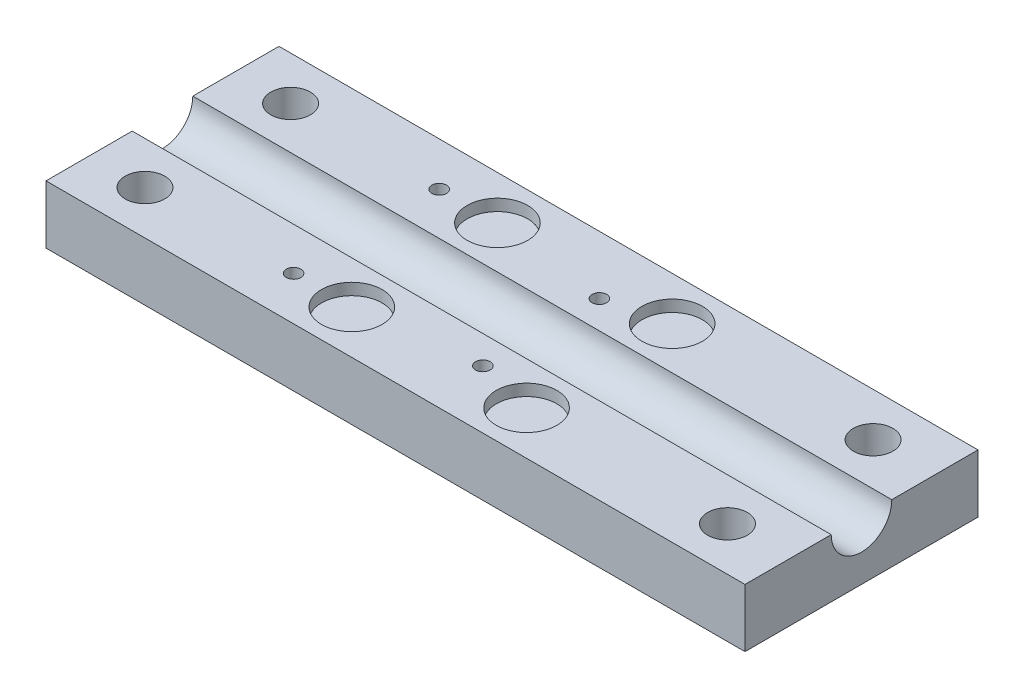
ISO-10303-21;
HEADER;
FILE_DESCRIPTION(('STEP AP214'),'2;1');
FILE_NAME('part.step','',(''),(''),'','','');
FILE_SCHEMA(('AUTOMOTIVE_DESIGN { 1 0 10303 214 1 1 1 1 }'));
ENDSEC;
DATA;
#1=APPLICATION_CONTEXT('core data for automotive mechanical design processes');
#2=APPLICATION_PROTOCOL_DEFINITION('international standard','automotive_design',2000,#1);
#3=PRODUCT_CONTEXT('',#1,'mechanical');
#4=PRODUCT('Part','Part','',(#3));
#5=PRODUCT_RELATED_PRODUCT_CATEGORY('part','',(#4));
#6=PRODUCT_DEFINITION_FORMATION('','',#4);
#7=PRODUCT_DEFINITION_CONTEXT('part definition',#1,'design');
#8=PRODUCT_DEFINITION('design','',#6,#7);
#9=PRODUCT_DEFINITION_SHAPE('','',#8);
#10=(LENGTH_UNIT() NAMED_UNIT(*) SI_UNIT(.MILLI.,.METRE.));
#11=(NAMED_UNIT(*) PLANE_ANGLE_UNIT() SI_UNIT($,.RADIAN.));
#12=(NAMED_UNIT(*) SI_UNIT($,.STERADIAN.) SOLID_ANGLE_UNIT());
#13=UNCERTAINTY_MEASURE_WITH_UNIT(LENGTH_MEASURE(1.E-05),#10,'distance_accuracy_value','');
#14=(GEOMETRIC_REPRESENTATION_CONTEXT(3) GLOBAL_UNCERTAINTY_ASSIGNED_CONTEXT((#13)) GLOBAL_UNIT_ASSIGNED_CONTEXT((#10,
#11,#12)) REPRESENTATION_CONTEXT('',''));
#15=CARTESIAN_POINT('',(0.,0.,0.));
#16=DIRECTION('',(0.,0.,1.));
#17=DIRECTION('',(1.,0.,0.));
#18=AXIS2_PLACEMENT_3D('',#15,#16,#17);
#19=CARTESIAN_POINT('',(0.,6.35,0.));
#20=DIRECTION('',(0.,1.,0.));
#21=DIRECTION('',(0.,0.,1.));
#22=AXIS2_PLACEMENT_3D('',#19,#20,#21);
#23=PLANE('',#22);
#24=DIRECTION('',(-1.,0.,0.));
#25=VECTOR('',#24,1.);
#26=CARTESIAN_POINT('',(38.1,6.35,-3.30200000000001));
#27=LINE('',#26,#25);
#28=CARTESIAN_POINT('',(38.1,6.35,-3.30200000000001));
#29=VERTEX_POINT('',#28);
#30=CARTESIAN_POINT('',(-38.1,6.35,-3.30199999999999));
#31=VERTEX_POINT('',#30);
#32=EDGE_CURVE('E11',#29,#31,#27,.T.);
#33=ORIENTED_EDGE('',*,*,#32,.F.);
#34=DIRECTION('',(0.,0.,-1.));
#35=VECTOR('',#34,1.);
#36=CARTESIAN_POINT('',(38.1,6.35,-12.7));
#37=LINE('',#36,#35);
#38=CARTESIAN_POINT('',(38.1,6.35,-12.7));
#39=VERTEX_POINT('',#38);
#40=EDGE_CURVE('E107',#29,#39,#37,.T.);
#41=ORIENTED_EDGE('',*,*,#40,.T.);
#42=DIRECTION('',(-1.,0.,0.));
#43=VECTOR('',#42,1.);
#44=CARTESIAN_POINT('',(-38.1,6.35,-12.7));
#45=LINE('',#44,#43);
#46=CARTESIAN_POINT('',(-38.1,6.35,-12.7));
#47=VERTEX_POINT('',#46);
#48=EDGE_CURVE('E58',#39,#47,#45,.T.);
#49=ORIENTED_EDGE('',*,*,#48,.T.);
#50=DIRECTION('',(0.,0.,1.));
#51=VECTOR('',#50,1.);
#52=CARTESIAN_POINT('',(-38.1,6.35,-12.7));
#53=LINE('',#52,#51);
#54=EDGE_CURVE('E101',#47,#31,#53,.T.);
#55=ORIENTED_EDGE('',*,*,#54,.T.);
#56=EDGE_LOOP('',(#33,#41,#49,#55));
#57=FACE_BOUND('',#56,.T.);
#58=CARTESIAN_POINT('',(-32.0740758823868,6.35,-7.9375));
#59=DIRECTION('',(0.,1.,0.));
#60=DIRECTION('',(0.,0.,1.));
#61=AXIS2_PLACEMENT_3D('',#58,#59,#60);
#62=CIRCLE('',#61,2.159);
#63=CARTESIAN_POINT('',(-32.0740758823868,6.35,-5.7785));
#64=VERTEX_POINT('',#63);
#65=EDGE_CURVE('E110',#64,#64,#62,.T.);
#66=ORIENTED_EDGE('',*,*,#65,.F.);
#67=EDGE_LOOP('',(#66));
#68=FACE_BOUND('',#67,.T.);
#69=CARTESIAN_POINT('',(31.4259241176133,6.35,-7.9375));
#70=DIRECTION('',(0.,1.,0.));
#71=DIRECTION('',(0.,0.,1.));
#72=AXIS2_PLACEMENT_3D('',#69,#70,#71);
#73=CIRCLE('',#72,2.159);
#74=CARTESIAN_POINT('',(31.4259241176133,6.35,-5.7785));
#75=VERTEX_POINT('',#74);
#76=EDGE_CURVE('E210',#75,#75,#73,.T.);
#77=ORIENTED_EDGE('',*,*,#76,.F.);
#78=EDGE_LOOP('',(#77));
#79=FACE_BOUND('',#78,.T.);
#80=CARTESIAN_POINT('',(-9.525,6.35,-7.9375));
#81=DIRECTION('',(0.,1.,0.));
#82=DIRECTION('',(0.,0.,1.));
#83=AXIS2_PLACEMENT_3D('',#80,#81,#82);
#84=CIRCLE('',#83,3.302);
#85=CARTESIAN_POINT('',(-9.525,6.35,-4.6355));
#86=VERTEX_POINT('',#85);
#87=EDGE_CURVE('E219',#86,#86,#84,.T.);
#88=ORIENTED_EDGE('',*,*,#87,.F.);
#89=EDGE_LOOP('',(#88));
#90=FACE_BOUND('',#89,.T.);
#91=CARTESIAN_POINT('',(9.525,6.35,-7.9375));
#92=DIRECTION('',(0.,1.,0.));
#93=DIRECTION('',(0.,0.,1.));
#94=AXIS2_PLACEMENT_3D('',#91,#92,#93);
#95=CIRCLE('',#94,3.302);
#96=CARTESIAN_POINT('',(9.525,6.35,-4.6355));
#97=VERTEX_POINT('',#96);
#98=EDGE_CURVE('E237',#97,#97,#95,.T.);
#99=ORIENTED_EDGE('',*,*,#98,.F.);
#100=EDGE_LOOP('',(#99));
#101=FACE_BOUND('',#100,.T.);
#102=CARTESIAN_POINT('',(-15.875,6.35,-7.9375));
#103=DIRECTION('',(0.,1.,0.));
#104=DIRECTION('',(0.,0.,1.));
#105=AXIS2_PLACEMENT_3D('',#102,#103,#104);
#106=CIRCLE('',#105,0.793749999999999);
#107=CARTESIAN_POINT('',(-15.875,6.35,-7.14375));
#108=VERTEX_POINT('',#107);
#109=EDGE_CURVE('E242',#108,#108,#106,.T.);
#110=ORIENTED_EDGE('',*,*,#109,.F.);
#111=EDGE_LOOP('',(#110));
#112=FACE_BOUND('',#111,.T.);
#113=CARTESIAN_POINT('',(3.175,6.35,-6.35));
#114=DIRECTION('',(0.,1.,0.));
#115=DIRECTION('',(0.,0.,1.));
#116=AXIS2_PLACEMENT_3D('',#113,#114,#115);
#117=CIRCLE('',#116,0.79375);
#118=CARTESIAN_POINT('',(3.175,6.35,-5.55625));
#119=VERTEX_POINT('',#118);
#120=EDGE_CURVE('E250',#119,#119,#117,.T.);
#121=ORIENTED_EDGE('',*,*,#120,.F.);
#122=EDGE_LOOP('',(#121));
#123=FACE_BOUND('',#122,.T.);
#124=ADVANCED_FACE('F35',(#57,#68,#79,#90,#101,#112,#123),#23,.T.);
#125=CARTESIAN_POINT('',(-38.1,6.35,-12.7));
#126=DIRECTION('',(1.,0.,0.));
#127=DIRECTION('',(0.,0.,-1.));
#128=AXIS2_PLACEMENT_3D('',#125,#126,#127);
#129=PLANE('',#128);
#130=CARTESIAN_POINT('',(-38.1,6.35,3.30200000000001));
#131=VERTEX_POINT('',#130);
#132=CARTESIAN_POINT('',(-38.1,6.35,12.7));
#133=VERTEX_POINT('',#132);
#134=EDGE_CURVE('E86',#131,#133,#53,.T.);
#135=ORIENTED_EDGE('',*,*,#134,.F.);
#136=CARTESIAN_POINT('',(-38.1,6.35,0.));
#137=DIRECTION('',(-1.,0.,0.));
#138=DIRECTION('',(0.,0.,1.));
#139=AXIS2_PLACEMENT_3D('',#136,#137,#138);
#140=CIRCLE('',#139,3.302);
#141=EDGE_CURVE('E49',#31,#131,#140,.T.);
#142=ORIENTED_EDGE('',*,*,#141,.F.);
#143=ORIENTED_EDGE('',*,*,#54,.F.);
#144=DIRECTION('',(0.,-1.,0.));
#145=VECTOR('',#144,1.);
#146=CARTESIAN_POINT('',(-38.1,6.35,-12.7));
#147=LINE('',#146,#145);
#148=CARTESIAN_POINT('',(-38.1,0.,-12.7));
#149=VERTEX_POINT('',#148);
#150=EDGE_CURVE('E117',#47,#149,#147,.T.);
#151=ORIENTED_EDGE('',*,*,#150,.T.);
#152=DIRECTION('',(0.,0.,1.));
#153=VECTOR('',#152,1.);
#154=CARTESIAN_POINT('',(-38.1,0.,-12.7));
#155=LINE('',#154,#153);
#156=CARTESIAN_POINT('',(-38.1,0.,12.7));
#157=VERTEX_POINT('',#156);
#158=EDGE_CURVE('E118',#149,#157,#155,.T.);
#159=ORIENTED_EDGE('',*,*,#158,.T.);
#160=DIRECTION('',(0.,-1.,0.));
#161=VECTOR('',#160,1.);
#162=CARTESIAN_POINT('',(-38.1,6.35,12.7));
#163=LINE('',#162,#161);
#164=EDGE_CURVE('E133',#133,#157,#163,.T.);
#165=ORIENTED_EDGE('',*,*,#164,.F.);
#166=EDGE_LOOP('',(#135,#142,#143,#151,#159,#165));
#167=FACE_BOUND('',#166,.T.);
#168=ADVANCED_FACE('F37',(#167),#129,.F.);
#169=CARTESIAN_POINT('',(-38.1,6.35,12.7));
#170=DIRECTION('',(0.,0.,-1.));
#171=DIRECTION('',(-1.,0.,0.));
#172=AXIS2_PLACEMENT_3D('',#169,#170,#171);
#173=PLANE('',#172);
#174=DIRECTION('',(1.,0.,0.));
#175=VECTOR('',#174,1.);
#176=CARTESIAN_POINT('',(-38.1,0.,12.7));
#177=LINE('',#176,#175);
#178=CARTESIAN_POINT('',(38.1,0.,12.7));
#179=VERTEX_POINT('',#178);
#180=EDGE_CURVE('E121',#157,#179,#177,.T.);
#181=ORIENTED_EDGE('',*,*,#180,.T.);
#182=DIRECTION('',(0.,-1.,0.));
#183=VECTOR('',#182,1.);
#184=CARTESIAN_POINT('',(38.1,6.35,12.7));
#185=LINE('',#184,#183);
#186=CARTESIAN_POINT('',(38.1,6.35,12.7));
#187=VERTEX_POINT('',#186);
#188=EDGE_CURVE('E130',#187,#179,#185,.T.);
#189=ORIENTED_EDGE('',*,*,#188,.F.);
#190=DIRECTION('',(1.,0.,0.));
#191=VECTOR('',#190,1.);
#192=CARTESIAN_POINT('',(-38.1,6.35,12.7));
#193=LINE('',#192,#191);
#194=EDGE_CURVE('E105',#133,#187,#193,.T.);
#195=ORIENTED_EDGE('',*,*,#194,.F.);
#196=ORIENTED_EDGE('',*,*,#164,.T.);
#197=EDGE_LOOP('',(#181,#189,#195,#196));
#198=FACE_BOUND('',#197,.T.);
#199=ADVANCED_FACE('F145',(#198),#173,.F.);
#200=CARTESIAN_POINT('',(38.1,6.35,-12.7));
#201=DIRECTION('',(-1.,0.,0.));
#202=DIRECTION('',(0.,0.,1.));
#203=AXIS2_PLACEMENT_3D('',#200,#201,#202);
#204=PLANE('',#203);
#205=ORIENTED_EDGE('',*,*,#40,.F.);
#206=CARTESIAN_POINT('',(38.1,6.35,0.));
#207=DIRECTION('',(-1.,0.,0.));
#208=DIRECTION('',(0.,0.,1.));
#209=AXIS2_PLACEMENT_3D('',#206,#207,#208);
#210=CIRCLE('',#209,3.302);
#211=CARTESIAN_POINT('',(38.1,6.35,3.30199999999999));
#212=VERTEX_POINT('',#211);
#213=EDGE_CURVE('E97',#29,#212,#210,.T.);
#214=ORIENTED_EDGE('',*,*,#213,.T.);
#215=EDGE_CURVE('E113',#187,#212,#37,.T.);
#216=ORIENTED_EDGE('',*,*,#215,.F.);
#217=ORIENTED_EDGE('',*,*,#188,.T.);
#218=DIRECTION('',(0.,0.,-1.));
#219=VECTOR('',#218,1.);
#220=CARTESIAN_POINT('',(38.1,0.,-12.7));
#221=LINE('',#220,#219);
#222=CARTESIAN_POINT('',(38.1,0.,-12.7));
#223=VERTEX_POINT('',#222);
#224=EDGE_CURVE('E124',#179,#223,#221,.T.);
#225=ORIENTED_EDGE('',*,*,#224,.T.);
#226=DIRECTION('',(0.,-1.,0.));
#227=VECTOR('',#226,1.);
#228=CARTESIAN_POINT('',(38.1,6.35,-12.7));
#229=LINE('',#228,#227);
#230=EDGE_CURVE('E128',#39,#223,#229,.T.);
#231=ORIENTED_EDGE('',*,*,#230,.F.);
#232=EDGE_LOOP('',(#205,#214,#216,#217,#225,#231));
#233=FACE_BOUND('',#232,.T.);
#234=ADVANCED_FACE('F137',(#233),#204,.F.);
#235=CARTESIAN_POINT('',(-38.1,6.35,-12.7));
#236=DIRECTION('',(0.,0.,1.));
#237=DIRECTION('',(1.,0.,0.));
#238=AXIS2_PLACEMENT_3D('',#235,#236,#237);
#239=PLANE('',#238);
#240=DIRECTION('',(-1.,0.,0.));
#241=VECTOR('',#240,1.);
#242=CARTESIAN_POINT('',(-38.1,0.,-12.7));
#243=LINE('',#242,#241);
#244=EDGE_CURVE('E79',#223,#149,#243,.T.);
#245=ORIENTED_EDGE('',*,*,#244,.T.);
#246=ORIENTED_EDGE('',*,*,#150,.F.);
#247=ORIENTED_EDGE('',*,*,#48,.F.);
#248=ORIENTED_EDGE('',*,*,#230,.T.);
#249=EDGE_LOOP('',(#245,#246,#247,#248));
#250=FACE_BOUND('',#249,.T.);
#251=ADVANCED_FACE('F150',(#250),#239,.F.);
#252=DIRECTION('',(-1.,0.,0.));
#253=VECTOR('',#252,1.);
#254=CARTESIAN_POINT('',(38.1,6.35,3.30199999999999));
#255=LINE('',#254,#253);
#256=EDGE_CURVE('E43',#131,#212,#255,.F.);
#257=ORIENTED_EDGE('',*,*,#256,.F.);
#258=ORIENTED_EDGE('',*,*,#134,.T.);
#259=ORIENTED_EDGE('',*,*,#194,.T.);
#260=ORIENTED_EDGE('',*,*,#215,.T.);
#261=EDGE_LOOP('',(#257,#258,#259,#260));
#262=FACE_BOUND('',#261,.T.);
#263=CARTESIAN_POINT('',(3.175,6.35,6.35));
#264=DIRECTION('',(0.,1.,0.));
#265=DIRECTION('',(0.,0.,1.));
#266=AXIS2_PLACEMENT_3D('',#263,#264,#265);
#267=CIRCLE('',#266,0.793750000000001);
#268=CARTESIAN_POINT('',(3.175,6.35,7.14375));
#269=VERTEX_POINT('',#268);
#270=EDGE_CURVE('E139',#269,#269,#267,.T.);
#271=ORIENTED_EDGE('',*,*,#270,.F.);
#272=EDGE_LOOP('',(#271));
#273=FACE_BOUND('',#272,.T.);
#274=CARTESIAN_POINT('',(-15.875,6.35,7.9375));
#275=DIRECTION('',(0.,1.,0.));
#276=DIRECTION('',(0.,0.,1.));
#277=AXIS2_PLACEMENT_3D('',#274,#275,#276);
#278=CIRCLE('',#277,0.79375);
#279=CARTESIAN_POINT('',(-15.875,6.35,8.73125));
#280=VERTEX_POINT('',#279);
#281=EDGE_CURVE('E246',#280,#280,#278,.T.);
#282=ORIENTED_EDGE('',*,*,#281,.F.);
#283=EDGE_LOOP('',(#282));
#284=FACE_BOUND('',#283,.T.);
#285=CARTESIAN_POINT('',(9.525,6.35,7.9375));
#286=DIRECTION('',(0.,1.,0.));
#287=DIRECTION('',(0.,0.,1.));
#288=AXIS2_PLACEMENT_3D('',#285,#286,#287);
#289=CIRCLE('',#288,3.302);
#290=CARTESIAN_POINT('',(9.525,6.35,11.2395));
#291=VERTEX_POINT('',#290);
#292=EDGE_CURVE('E231',#291,#291,#289,.T.);
#293=ORIENTED_EDGE('',*,*,#292,.F.);
#294=EDGE_LOOP('',(#293));
#295=FACE_BOUND('',#294,.T.);
#296=CARTESIAN_POINT('',(-9.525,6.35,7.9375));
#297=DIRECTION('',(0.,1.,0.));
#298=DIRECTION('',(0.,0.,1.));
#299=AXIS2_PLACEMENT_3D('',#296,#297,#298);
#300=CIRCLE('',#299,3.302);
#301=CARTESIAN_POINT('',(-9.525,6.35,11.2395));
#302=VERTEX_POINT('',#301);
#303=EDGE_CURVE('E225',#302,#302,#300,.T.);
#304=ORIENTED_EDGE('',*,*,#303,.F.);
#305=EDGE_LOOP('',(#304));
#306=FACE_BOUND('',#305,.T.);
#307=CARTESIAN_POINT('',(31.4259241176133,6.35,7.9375));
#308=DIRECTION('',(0.,1.,0.));
#309=DIRECTION('',(0.,0.,1.));
#310=AXIS2_PLACEMENT_3D('',#307,#308,#309);
#311=CIRCLE('',#310,2.159);
#312=CARTESIAN_POINT('',(31.4259241176133,6.35,10.0965));
#313=VERTEX_POINT('',#312);
#314=EDGE_CURVE('E214',#313,#313,#311,.T.);
#315=ORIENTED_EDGE('',*,*,#314,.F.);
#316=EDGE_LOOP('',(#315));
#317=FACE_BOUND('',#316,.T.);
#318=CARTESIAN_POINT('',(-32.0740758823868,6.35,7.9375));
#319=DIRECTION('',(0.,1.,0.));
#320=DIRECTION('',(0.,0.,1.));
#321=AXIS2_PLACEMENT_3D('',#318,#319,#320);
#322=CIRCLE('',#321,2.159);
#323=CARTESIAN_POINT('',(-32.0740758823868,6.35,10.0965));
#324=VERTEX_POINT('',#323);
#325=EDGE_CURVE('E206',#324,#324,#322,.T.);
#326=ORIENTED_EDGE('',*,*,#325,.F.);
#327=EDGE_LOOP('',(#326));
#328=FACE_BOUND('',#327,.T.);
#329=ADVANCED_FACE('F141',(#262,#273,#284,#295,#306,#317,#328),#23,.T.);
#330=CARTESIAN_POINT('',(0.,0.,0.));
#331=DIRECTION('',(0.,1.,0.));
#332=DIRECTION('',(0.,0.,1.));
#333=AXIS2_PLACEMENT_3D('',#330,#331,#332);
#334=PLANE('',#333);
#335=CARTESIAN_POINT('',(3.175,0.,6.35));
#336=DIRECTION('',(0.,1.,0.));
#337=DIRECTION('',(0.,0.,1.));
#338=AXIS2_PLACEMENT_3D('',#335,#336,#337);
#339=CIRCLE('',#338,0.793750000000001);
#340=CARTESIAN_POINT('',(3.175,0.,7.14375));
#341=VERTEX_POINT('',#340);
#342=EDGE_CURVE('E177',#341,#341,#339,.T.);
#343=ORIENTED_EDGE('',*,*,#342,.T.);
#344=EDGE_LOOP('',(#343));
#345=FACE_BOUND('',#344,.T.);
#346=CARTESIAN_POINT('',(3.175,0.,-6.35));
#347=DIRECTION('',(0.,1.,0.));
#348=DIRECTION('',(0.,0.,1.));
#349=AXIS2_PLACEMENT_3D('',#346,#347,#348);
#350=CIRCLE('',#349,0.79375);
#351=CARTESIAN_POINT('',(3.175,0.,-5.55625));
#352=VERTEX_POINT('',#351);
#353=EDGE_CURVE('E181',#352,#352,#350,.T.);
#354=ORIENTED_EDGE('',*,*,#353,.T.);
#355=EDGE_LOOP('',(#354));
#356=FACE_BOUND('',#355,.T.);
#357=CARTESIAN_POINT('',(-15.875,0.,7.9375));
#358=DIRECTION('',(0.,1.,0.));
#359=DIRECTION('',(0.,0.,1.));
#360=AXIS2_PLACEMENT_3D('',#357,#358,#359);
#361=CIRCLE('',#360,0.79375);
#362=CARTESIAN_POINT('',(-15.875,0.,8.73125));
#363=VERTEX_POINT('',#362);
#364=EDGE_CURVE('E185',#363,#363,#361,.T.);
#365=ORIENTED_EDGE('',*,*,#364,.T.);
#366=EDGE_LOOP('',(#365));
#367=FACE_BOUND('',#366,.T.);
#368=CARTESIAN_POINT('',(-15.875,0.,-7.9375));
#369=DIRECTION('',(0.,1.,0.));
#370=DIRECTION('',(0.,0.,1.));
#371=AXIS2_PLACEMENT_3D('',#368,#369,#370);
#372=CIRCLE('',#371,0.793749999999999);
#373=CARTESIAN_POINT('',(-15.875,0.,-7.14375));
#374=VERTEX_POINT('',#373);
#375=EDGE_CURVE('E189',#374,#374,#372,.T.);
#376=ORIENTED_EDGE('',*,*,#375,.T.);
#377=EDGE_LOOP('',(#376));
#378=FACE_BOUND('',#377,.T.);
#379=CARTESIAN_POINT('',(31.4259241176133,0.,7.9375));
#380=DIRECTION('',(0.,1.,0.));
#381=DIRECTION('',(0.,0.,1.));
#382=AXIS2_PLACEMENT_3D('',#379,#380,#381);
#383=CIRCLE('',#382,2.159);
#384=CARTESIAN_POINT('',(31.4259241176133,0.,10.0965));
#385=VERTEX_POINT('',#384);
#386=EDGE_CURVE('E193',#385,#385,#383,.T.);
#387=ORIENTED_EDGE('',*,*,#386,.T.);
#388=EDGE_LOOP('',(#387));
#389=FACE_BOUND('',#388,.T.);
#390=CARTESIAN_POINT('',(31.4259241176133,0.,-7.9375));
#391=DIRECTION('',(0.,1.,0.));
#392=DIRECTION('',(0.,0.,1.));
#393=AXIS2_PLACEMENT_3D('',#390,#391,#392);
#394=CIRCLE('',#393,2.159);
#395=CARTESIAN_POINT('',(31.4259241176133,0.,-5.7785));
#396=VERTEX_POINT('',#395);
#397=EDGE_CURVE('E197',#396,#396,#394,.T.);
#398=ORIENTED_EDGE('',*,*,#397,.T.);
#399=EDGE_LOOP('',(#398));
#400=FACE_BOUND('',#399,.T.);
#401=CARTESIAN_POINT('',(-32.0740758823868,0.,7.9375));
#402=DIRECTION('',(0.,1.,0.));
#403=DIRECTION('',(0.,0.,1.));
#404=AXIS2_PLACEMENT_3D('',#401,#402,#403);
#405=CIRCLE('',#404,2.159);
#406=CARTESIAN_POINT('',(-32.0740758823868,0.,10.0965));
#407=VERTEX_POINT('',#406);
#408=EDGE_CURVE('E201',#407,#407,#405,.T.);
#409=ORIENTED_EDGE('',*,*,#408,.T.);
#410=EDGE_LOOP('',(#409));
#411=FACE_BOUND('',#410,.T.);
#412=CARTESIAN_POINT('',(-32.0740758823868,0.,-7.9375));
#413=DIRECTION('',(0.,1.,0.));
#414=DIRECTION('',(0.,0.,1.));
#415=AXIS2_PLACEMENT_3D('',#412,#413,#414);
#416=CIRCLE('',#415,2.159);
#417=CARTESIAN_POINT('',(-32.0740758823868,0.,-5.7785));
#418=VERTEX_POINT('',#417);
#419=EDGE_CURVE('E122',#418,#418,#416,.T.);
#420=ORIENTED_EDGE('',*,*,#419,.T.);
#421=EDGE_LOOP('',(#420));
#422=FACE_BOUND('',#421,.T.);
#423=ORIENTED_EDGE('',*,*,#158,.F.);
#424=ORIENTED_EDGE('',*,*,#244,.F.);
#425=ORIENTED_EDGE('',*,*,#224,.F.);
#426=ORIENTED_EDGE('',*,*,#180,.F.);
#427=EDGE_LOOP('',(#423,#424,#425,#426));
#428=FACE_BOUND('',#427,.T.);
#429=ADVANCED_FACE('F149',(#345,#356,#367,#378,#389,#400,#411,#422,#428),#334,.F.);
#430=CARTESIAN_POINT('',(-32.0740758823868,0.,-7.9375));
#431=DIRECTION('',(0.,1.,0.));
#432=DIRECTION('',(0.,0.,1.));
#433=AXIS2_PLACEMENT_3D('',#430,#431,#432);
#434=CYLINDRICAL_SURFACE('',#433,2.159);
#435=ORIENTED_EDGE('',*,*,#419,.F.);
#436=EDGE_LOOP('',(#435));
#437=FACE_BOUND('',#436,.T.);
#438=ORIENTED_EDGE('',*,*,#65,.T.);
#439=EDGE_LOOP('',(#438));
#440=FACE_BOUND('',#439,.T.);
#441=ADVANCED_FACE('F165',(#437,#440),#434,.F.);
#442=CARTESIAN_POINT('',(-32.0740758823868,0.,7.9375));
#443=DIRECTION('',(0.,1.,0.));
#444=DIRECTION('',(0.,0.,1.));
#445=AXIS2_PLACEMENT_3D('',#442,#443,#444);
#446=CYLINDRICAL_SURFACE('',#445,2.159);
#447=ORIENTED_EDGE('',*,*,#408,.F.);
#448=EDGE_LOOP('',(#447));
#449=FACE_BOUND('',#448,.T.);
#450=ORIENTED_EDGE('',*,*,#325,.T.);
#451=EDGE_LOOP('',(#450));
#452=FACE_BOUND('',#451,.T.);
#453=ADVANCED_FACE('F172',(#449,#452),#446,.F.);
#454=CARTESIAN_POINT('',(31.4259241176133,0.,-7.9375));
#455=DIRECTION('',(0.,1.,0.));
#456=DIRECTION('',(0.,0.,1.));
#457=AXIS2_PLACEMENT_3D('',#454,#455,#456);
#458=CYLINDRICAL_SURFACE('',#457,2.159);
#459=ORIENTED_EDGE('',*,*,#397,.F.);
#460=EDGE_LOOP('',(#459));
#461=FACE_BOUND('',#460,.T.);
#462=ORIENTED_EDGE('',*,*,#76,.T.);
#463=EDGE_LOOP('',(#462));
#464=FACE_BOUND('',#463,.T.);
#465=ADVANCED_FACE('F271',(#461,#464),#458,.F.);
#466=CARTESIAN_POINT('',(31.4259241176133,0.,7.9375));
#467=DIRECTION('',(0.,1.,0.));
#468=DIRECTION('',(0.,0.,1.));
#469=AXIS2_PLACEMENT_3D('',#466,#467,#468);
#470=CYLINDRICAL_SURFACE('',#469,2.159);
#471=ORIENTED_EDGE('',*,*,#386,.F.);
#472=EDGE_LOOP('',(#471));
#473=FACE_BOUND('',#472,.T.);
#474=ORIENTED_EDGE('',*,*,#314,.T.);
#475=EDGE_LOOP('',(#474));
#476=FACE_BOUND('',#475,.T.);
#477=ADVANCED_FACE('F276',(#473,#476),#470,.F.);
#478=CARTESIAN_POINT('',(-9.525,5.08,-7.9375));
#479=DIRECTION('',(0.,1.,0.));
#480=DIRECTION('',(0.,0.,1.));
#481=AXIS2_PLACEMENT_3D('',#478,#479,#480);
#482=CYLINDRICAL_SURFACE('',#481,3.302);
#483=CARTESIAN_POINT('',(-9.525,5.08,-7.9375));
#484=DIRECTION('',(0.,1.,0.));
#485=DIRECTION('',(0.,0.,1.));
#486=AXIS2_PLACEMENT_3D('',#483,#484,#485);
#487=CIRCLE('',#486,3.302);
#488=CARTESIAN_POINT('',(-9.525,5.08,-4.6355));
#489=VERTEX_POINT('',#488);
#490=EDGE_CURVE('E217',#489,#489,#487,.T.);
#491=ORIENTED_EDGE('',*,*,#490,.F.);
#492=EDGE_LOOP('',(#491));
#493=FACE_BOUND('',#492,.T.);
#494=ORIENTED_EDGE('',*,*,#87,.T.);
#495=EDGE_LOOP('',(#494));
#496=FACE_BOUND('',#495,.T.);
#497=ADVANCED_FACE('F282',(#493,#496),#482,.F.);
#498=CARTESIAN_POINT('',(-9.525,5.08,-7.9375));
#499=DIRECTION('',(0.,1.,0.));
#500=DIRECTION('',(0.,0.,1.));
#501=AXIS2_PLACEMENT_3D('',#498,#499,#500);
#502=PLANE('',#501);
#503=ORIENTED_EDGE('',*,*,#490,.T.);
#504=EDGE_LOOP('',(#503));
#505=FACE_BOUND('',#504,.T.);
#506=ADVANCED_FACE('F286',(#505),#502,.T.);
#507=CARTESIAN_POINT('',(-9.525,5.08,7.9375));
#508=DIRECTION('',(0.,1.,0.));
#509=DIRECTION('',(0.,0.,1.));
#510=AXIS2_PLACEMENT_3D('',#507,#508,#509);
#511=CYLINDRICAL_SURFACE('',#510,3.302);
#512=CARTESIAN_POINT('',(-9.525,5.08,7.9375));
#513=DIRECTION('',(0.,1.,0.));
#514=DIRECTION('',(0.,0.,1.));
#515=AXIS2_PLACEMENT_3D('',#512,#513,#514);
#516=CIRCLE('',#515,3.302);
#517=CARTESIAN_POINT('',(-9.525,5.08,11.2395));
#518=VERTEX_POINT('',#517);
#519=EDGE_CURVE('E222',#518,#518,#516,.T.);
#520=ORIENTED_EDGE('',*,*,#519,.F.);
#521=EDGE_LOOP('',(#520));
#522=FACE_BOUND('',#521,.T.);
#523=ORIENTED_EDGE('',*,*,#303,.T.);
#524=EDGE_LOOP('',(#523));
#525=FACE_BOUND('',#524,.T.);
#526=ADVANCED_FACE('F290',(#522,#525),#511,.F.);
#527=CARTESIAN_POINT('',(-9.525,5.08,7.9375));
#528=DIRECTION('',(0.,1.,0.));
#529=DIRECTION('',(0.,0.,1.));
#530=AXIS2_PLACEMENT_3D('',#527,#528,#529);
#531=PLANE('',#530);
#532=ORIENTED_EDGE('',*,*,#519,.T.);
#533=EDGE_LOOP('',(#532));
#534=FACE_BOUND('',#533,.T.);
#535=ADVANCED_FACE('F294',(#534),#531,.T.);
#536=CARTESIAN_POINT('',(9.525,5.08,7.9375));
#537=DIRECTION('',(0.,1.,0.));
#538=DIRECTION('',(0.,0.,1.));
#539=AXIS2_PLACEMENT_3D('',#536,#537,#538);
#540=CYLINDRICAL_SURFACE('',#539,3.302);
#541=CARTESIAN_POINT('',(9.525,5.08,7.9375));
#542=DIRECTION('',(0.,1.,0.));
#543=DIRECTION('',(0.,0.,1.));
#544=AXIS2_PLACEMENT_3D('',#541,#542,#543);
#545=CIRCLE('',#544,3.302);
#546=CARTESIAN_POINT('',(9.525,5.08,11.2395));
#547=VERTEX_POINT('',#546);
#548=EDGE_CURVE('E228',#547,#547,#545,.T.);
#549=ORIENTED_EDGE('',*,*,#548,.F.);
#550=EDGE_LOOP('',(#549));
#551=FACE_BOUND('',#550,.T.);
#552=ORIENTED_EDGE('',*,*,#292,.T.);
#553=EDGE_LOOP('',(#552));
#554=FACE_BOUND('',#553,.T.);
#555=ADVANCED_FACE('F298',(#551,#554),#540,.F.);
#556=CARTESIAN_POINT('',(9.525,5.08,7.9375));
#557=DIRECTION('',(0.,1.,0.));
#558=DIRECTION('',(0.,0.,1.));
#559=AXIS2_PLACEMENT_3D('',#556,#557,#558);
#560=PLANE('',#559);
#561=ORIENTED_EDGE('',*,*,#548,.T.);
#562=EDGE_LOOP('',(#561));
#563=FACE_BOUND('',#562,.T.);
#564=ADVANCED_FACE('F302',(#563),#560,.T.);
#565=CARTESIAN_POINT('',(9.525,5.08,-7.9375));
#566=DIRECTION('',(0.,1.,0.));
#567=DIRECTION('',(0.,0.,1.));
#568=AXIS2_PLACEMENT_3D('',#565,#566,#567);
#569=CYLINDRICAL_SURFACE('',#568,3.302);
#570=CARTESIAN_POINT('',(9.525,5.08,-7.9375));
#571=DIRECTION('',(0.,1.,0.));
#572=DIRECTION('',(0.,0.,1.));
#573=AXIS2_PLACEMENT_3D('',#570,#571,#572);
#574=CIRCLE('',#573,3.302);
#575=CARTESIAN_POINT('',(9.525,5.08,-4.6355));
#576=VERTEX_POINT('',#575);
#577=EDGE_CURVE('E234',#576,#576,#574,.T.);
#578=ORIENTED_EDGE('',*,*,#577,.F.);
#579=EDGE_LOOP('',(#578));
#580=FACE_BOUND('',#579,.T.);
#581=ORIENTED_EDGE('',*,*,#98,.T.);
#582=EDGE_LOOP('',(#581));
#583=FACE_BOUND('',#582,.T.);
#584=ADVANCED_FACE('F306',(#580,#583),#569,.F.);
#585=CARTESIAN_POINT('',(9.525,5.08,-7.9375));
#586=DIRECTION('',(0.,1.,0.));
#587=DIRECTION('',(0.,0.,1.));
#588=AXIS2_PLACEMENT_3D('',#585,#586,#587);
#589=PLANE('',#588);
#590=ORIENTED_EDGE('',*,*,#577,.T.);
#591=EDGE_LOOP('',(#590));
#592=FACE_BOUND('',#591,.T.);
#593=ADVANCED_FACE('F310',(#592),#589,.T.);
#594=CARTESIAN_POINT('',(-15.875,0.,-7.9375));
#595=DIRECTION('',(0.,1.,0.));
#596=DIRECTION('',(0.,0.,1.));
#597=AXIS2_PLACEMENT_3D('',#594,#595,#596);
#598=CYLINDRICAL_SURFACE('',#597,0.793749999999999);
#599=ORIENTED_EDGE('',*,*,#375,.F.);
#600=EDGE_LOOP('',(#599));
#601=FACE_BOUND('',#600,.T.);
#602=ORIENTED_EDGE('',*,*,#109,.T.);
#603=EDGE_LOOP('',(#602));
#604=FACE_BOUND('',#603,.T.);
#605=ADVANCED_FACE('F314',(#601,#604),#598,.F.);
#606=CARTESIAN_POINT('',(-15.875,0.,7.9375));
#607=DIRECTION('',(0.,1.,0.));
#608=DIRECTION('',(0.,0.,1.));
#609=AXIS2_PLACEMENT_3D('',#606,#607,#608);
#610=CYLINDRICAL_SURFACE('',#609,0.79375);
#611=ORIENTED_EDGE('',*,*,#364,.F.);
#612=EDGE_LOOP('',(#611));
#613=FACE_BOUND('',#612,.T.);
#614=ORIENTED_EDGE('',*,*,#281,.T.);
#615=EDGE_LOOP('',(#614));
#616=FACE_BOUND('',#615,.T.);
#617=ADVANCED_FACE('F318',(#613,#616),#610,.F.);
#618=CARTESIAN_POINT('',(3.175,0.,-6.35));
#619=DIRECTION('',(0.,1.,0.));
#620=DIRECTION('',(0.,0.,1.));
#621=AXIS2_PLACEMENT_3D('',#618,#619,#620);
#622=CYLINDRICAL_SURFACE('',#621,0.79375);
#623=ORIENTED_EDGE('',*,*,#353,.F.);
#624=EDGE_LOOP('',(#623));
#625=FACE_BOUND('',#624,.T.);
#626=ORIENTED_EDGE('',*,*,#120,.T.);
#627=EDGE_LOOP('',(#626));
#628=FACE_BOUND('',#627,.T.);
#629=ADVANCED_FACE('F322',(#625,#628),#622,.F.);
#630=CARTESIAN_POINT('',(3.175,0.,6.35));
#631=DIRECTION('',(0.,1.,0.));
#632=DIRECTION('',(0.,0.,1.));
#633=AXIS2_PLACEMENT_3D('',#630,#631,#632);
#634=CYLINDRICAL_SURFACE('',#633,0.793750000000001);
#635=ORIENTED_EDGE('',*,*,#342,.F.);
#636=EDGE_LOOP('',(#635));
#637=FACE_BOUND('',#636,.T.);
#638=ORIENTED_EDGE('',*,*,#270,.T.);
#639=EDGE_LOOP('',(#638));
#640=FACE_BOUND('',#639,.T.);
#641=ADVANCED_FACE('F258',(#637,#640),#634,.F.);
#642=CARTESIAN_POINT('',(38.1,6.35,0.));
#643=DIRECTION('',(-1.,0.,0.));
#644=DIRECTION('',(0.,0.,1.));
#645=AXIS2_PLACEMENT_3D('',#642,#643,#644);
#646=CYLINDRICAL_SURFACE('',#645,3.302);
#647=ORIENTED_EDGE('',*,*,#32,.T.);
#648=ORIENTED_EDGE('',*,*,#141,.T.);
#649=ORIENTED_EDGE('',*,*,#256,.T.);
#650=ORIENTED_EDGE('',*,*,#213,.F.);
#651=EDGE_LOOP('',(#647,#648,#649,#650));
#652=FACE_BOUND('',#651,.T.);
#653=ADVANCED_FACE('F95',(#652),#646,.F.);
#654=CLOSED_SHELL('',(#124,#168,#199,#234,#251,#329,#429,#441,#453,#465,#477,#497,#506,#526,
#535,#555,#564,#584,#593,#605,#617,#629,#641,#653));
#655=MANIFOLD_SOLID_BREP('B2',#654);
#656=ADVANCED_BREP_SHAPE_REPRESENTATION('',(#18,#655),#14);
#657=SHAPE_DEFINITION_REPRESENTATION(#9,#656);
ENDSEC;
END-ISO-10303-21;
